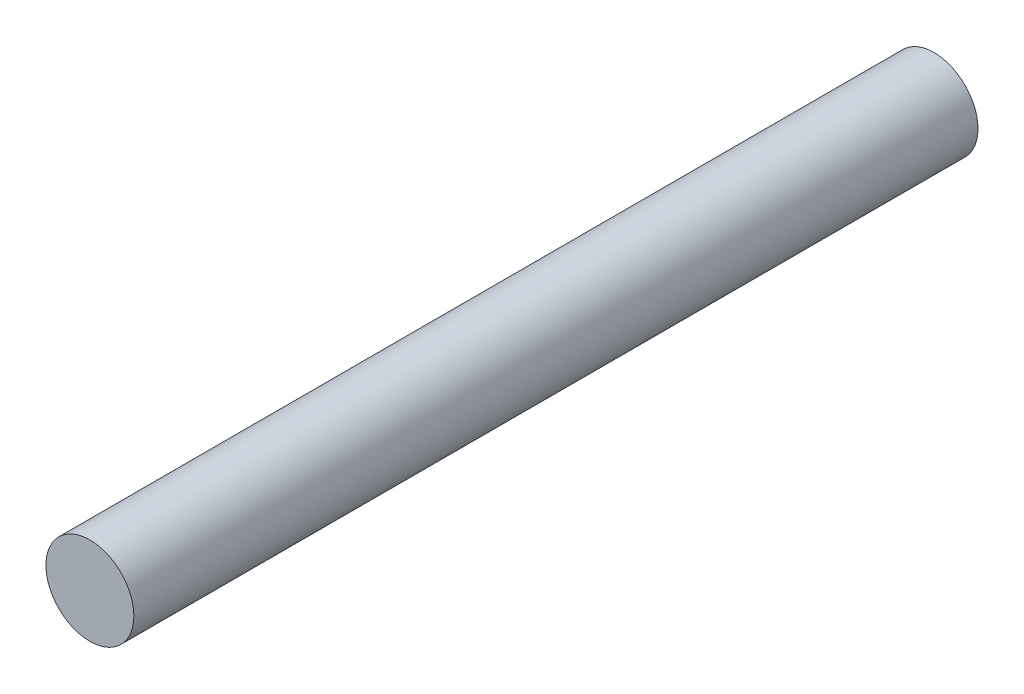
ISO-10303-21;
HEADER;
FILE_DESCRIPTION(('STEP AP214'),'2;1');
FILE_NAME('part.step','',(''),(''),'','','');
FILE_SCHEMA(('AUTOMOTIVE_DESIGN { 1 0 10303 214 1 1 1 1 }'));
ENDSEC;
DATA;
#1=APPLICATION_CONTEXT('core data for automotive mechanical design processes');
#2=APPLICATION_PROTOCOL_DEFINITION('international standard','automotive_design',2000,#1);
#3=PRODUCT_CONTEXT('',#1,'mechanical');
#4=PRODUCT('Part','Part','',(#3));
#5=PRODUCT_RELATED_PRODUCT_CATEGORY('part','',(#4));
#6=PRODUCT_DEFINITION_FORMATION('','',#4);
#7=PRODUCT_DEFINITION_CONTEXT('part definition',#1,'design');
#8=PRODUCT_DEFINITION('design','',#6,#7);
#9=PRODUCT_DEFINITION_SHAPE('','',#8);
#10=(LENGTH_UNIT() NAMED_UNIT(*) SI_UNIT(.MILLI.,.METRE.));
#11=(NAMED_UNIT(*) PLANE_ANGLE_UNIT() SI_UNIT($,.RADIAN.));
#12=(NAMED_UNIT(*) SI_UNIT($,.STERADIAN.) SOLID_ANGLE_UNIT());
#13=UNCERTAINTY_MEASURE_WITH_UNIT(LENGTH_MEASURE(1.E-05),#10,'distance_accuracy_value','');
#14=(GEOMETRIC_REPRESENTATION_CONTEXT(3) GLOBAL_UNCERTAINTY_ASSIGNED_CONTEXT((#13)) GLOBAL_UNIT_ASSIGNED_CONTEXT((#10,
#11,#12)) REPRESENTATION_CONTEXT('',''));
#15=CARTESIAN_POINT('',(0.,0.,0.));
#16=DIRECTION('',(0.,0.,1.));
#17=DIRECTION('',(1.,0.,0.));
#18=AXIS2_PLACEMENT_3D('',#15,#16,#17);
#19=CARTESIAN_POINT('',(-4.17987094450076,1.24719700178908,24.));
#20=DIRECTION('',(0.,0.,-1.));
#21=DIRECTION('',(-1.,0.,0.));
#22=AXIS2_PLACEMENT_3D('',#19,#20,#21);
#23=CYLINDRICAL_SURFACE('',#22,1.25);
#24=CARTESIAN_POINT('',(-4.17987094450076,1.24719700178908,24.));
#25=DIRECTION('',(0.,0.,1.));
#26=DIRECTION('',(1.,0.,0.));
#27=AXIS2_PLACEMENT_3D('',#24,#25,#26);
#28=CIRCLE('',#27,1.25);
#29=CARTESIAN_POINT('',(-2.92987094450076,1.24719700178908,24.));
#30=VERTEX_POINT('',#29);
#31=EDGE_CURVE('E10',#30,#30,#28,.T.);
#32=ORIENTED_EDGE('',*,*,#31,.F.);
#33=EDGE_LOOP('',(#32));
#34=FACE_BOUND('',#33,.T.);
#35=CARTESIAN_POINT('',(-4.17987094450076,1.24719700178908,0.));
#36=DIRECTION('',(0.,0.,1.));
#37=DIRECTION('',(1.,0.,0.));
#38=AXIS2_PLACEMENT_3D('',#35,#36,#37);
#39=CIRCLE('',#38,1.25);
#40=CARTESIAN_POINT('',(-2.92987094450076,1.24719700178908,0.));
#41=VERTEX_POINT('',#40);
#42=EDGE_CURVE('E36',#41,#41,#39,.T.);
#43=ORIENTED_EDGE('',*,*,#42,.T.);
#44=EDGE_LOOP('',(#43));
#45=FACE_BOUND('',#44,.T.);
#46=ADVANCED_FACE('F33',(#34,#45),#23,.T.);
#47=CARTESIAN_POINT('',(-4.17987094450076,1.24719700178908,24.));
#48=DIRECTION('',(0.,0.,1.));
#49=DIRECTION('',(1.,0.,0.));
#50=AXIS2_PLACEMENT_3D('',#47,#48,#49);
#51=PLANE('',#50);
#52=ORIENTED_EDGE('',*,*,#31,.T.);
#53=EDGE_LOOP('',(#52));
#54=FACE_BOUND('',#53,.T.);
#55=ADVANCED_FACE('F48',(#54),#51,.T.);
#56=CARTESIAN_POINT('',(-4.17987094450076,1.24719700178908,0.));
#57=DIRECTION('',(0.,0.,1.));
#58=DIRECTION('',(1.,0.,0.));
#59=AXIS2_PLACEMENT_3D('',#56,#57,#58);
#60=PLANE('',#59);
#61=ORIENTED_EDGE('',*,*,#42,.F.);
#62=EDGE_LOOP('',(#61));
#63=FACE_BOUND('',#62,.T.);
#64=ADVANCED_FACE('F46',(#63),#60,.F.);
#65=CLOSED_SHELL('',(#46,#55,#64));
#66=MANIFOLD_SOLID_BREP('B2',#65);
#67=ADVANCED_BREP_SHAPE_REPRESENTATION('',(#18,#66),#14);
#68=SHAPE_DEFINITION_REPRESENTATION(#9,#67);
ENDSEC;
END-ISO-10303-21;
